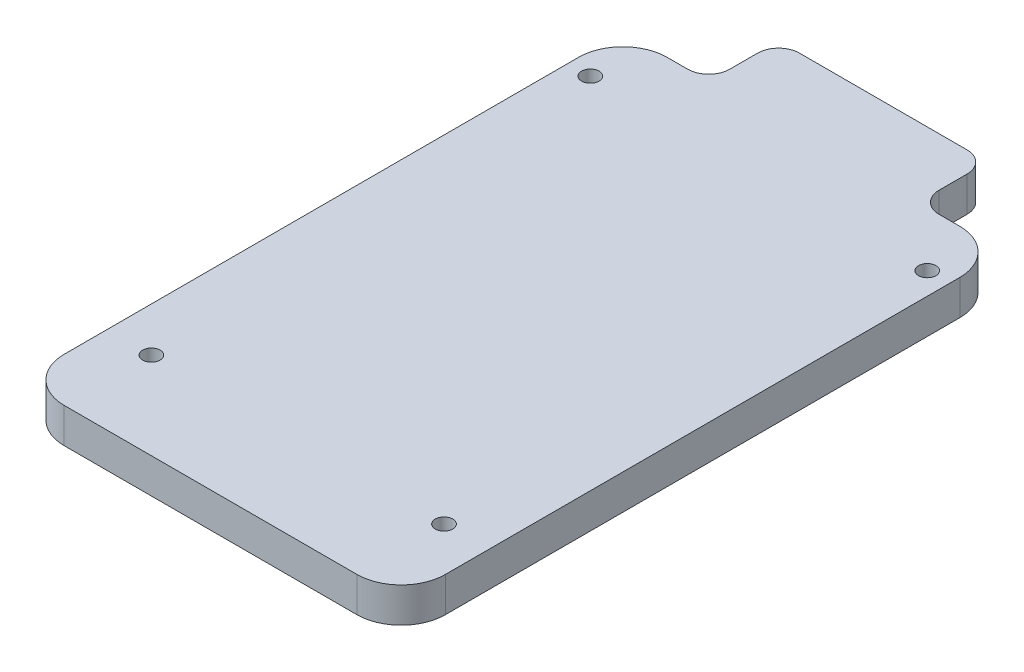
ISO-10303-21;
HEADER;
FILE_DESCRIPTION(('STEP AP214'),'2;1');
FILE_NAME('part.step','',(''),(''),'','','');
FILE_SCHEMA(('AUTOMOTIVE_DESIGN { 1 0 10303 214 1 1 1 1 }'));
ENDSEC;
DATA;
#1=APPLICATION_CONTEXT('core data for automotive mechanical design processes');
#2=APPLICATION_PROTOCOL_DEFINITION('international standard','automotive_design',2000,#1);
#3=PRODUCT_CONTEXT('',#1,'mechanical');
#4=PRODUCT('Part','Part','',(#3));
#5=PRODUCT_RELATED_PRODUCT_CATEGORY('part','',(#4));
#6=PRODUCT_DEFINITION_FORMATION('','',#4);
#7=PRODUCT_DEFINITION_CONTEXT('part definition',#1,'design');
#8=PRODUCT_DEFINITION('design','',#6,#7);
#9=PRODUCT_DEFINITION_SHAPE('','',#8);
#10=(LENGTH_UNIT() NAMED_UNIT(*) SI_UNIT(.MILLI.,.METRE.));
#11=(NAMED_UNIT(*) PLANE_ANGLE_UNIT() SI_UNIT($,.RADIAN.));
#12=(NAMED_UNIT(*) SI_UNIT($,.STERADIAN.) SOLID_ANGLE_UNIT());
#13=UNCERTAINTY_MEASURE_WITH_UNIT(LENGTH_MEASURE(1.E-05),#10,'distance_accuracy_value','');
#14=(GEOMETRIC_REPRESENTATION_CONTEXT(3) GLOBAL_UNCERTAINTY_ASSIGNED_CONTEXT((#13)) GLOBAL_UNIT_ASSIGNED_CONTEXT((#10,
#11,#12)) REPRESENTATION_CONTEXT('',''));
#15=CARTESIAN_POINT('',(0.,0.,0.));
#16=DIRECTION('',(0.,0.,1.));
#17=DIRECTION('',(1.,0.,0.));
#18=AXIS2_PLACEMENT_3D('',#15,#16,#17);
#19=CARTESIAN_POINT('',(20.955,5.,-43.18));
#20=DIRECTION('',(0.,0.,1.));
#21=DIRECTION('',(1.,0.,0.));
#22=AXIS2_PLACEMENT_3D('',#19,#20,#21);
#23=PLANE('',#22);
#24=DIRECTION('',(-1.,0.,0.));
#25=VECTOR('',#24,1.);
#26=CARTESIAN_POINT('',(20.955,5.,-43.18));
#27=LINE('',#26,#25);
#28=CARTESIAN_POINT('',(-18.,5.,-43.18));
#29=VERTEX_POINT('',#28);
#30=CARTESIAN_POINT('',(-20.955,5.,-43.18));
#31=VERTEX_POINT('',#30);
#32=EDGE_CURVE('E225',#29,#31,#27,.T.);
#33=ORIENTED_EDGE('',*,*,#32,.F.);
#34=DIRECTION('',(0.,1.,0.));
#35=VECTOR('',#34,1.);
#36=CARTESIAN_POINT('',(-18.,5.,-43.18));
#37=LINE('',#36,#35);
#38=CARTESIAN_POINT('',(-18.,0.,-43.18));
#39=VERTEX_POINT('',#38);
#40=EDGE_CURVE('E299',#29,#39,#37,.F.);
#41=ORIENTED_EDGE('',*,*,#40,.T.);
#42=DIRECTION('',(-1.,0.,0.));
#43=VECTOR('',#42,1.);
#44=CARTESIAN_POINT('',(20.955,0.,-43.18));
#45=LINE('',#44,#43);
#46=CARTESIAN_POINT('',(-20.955,0.,-43.18));
#47=VERTEX_POINT('',#46);
#48=EDGE_CURVE('E244',#39,#47,#45,.T.);
#49=ORIENTED_EDGE('',*,*,#48,.T.);
#50=DIRECTION('',(0.,-1.,0.));
#51=VECTOR('',#50,1.);
#52=CARTESIAN_POINT('',(-20.955,5.,-43.18));
#53=LINE('',#52,#51);
#54=EDGE_CURVE('E256',#31,#47,#53,.T.);
#55=ORIENTED_EDGE('',*,*,#54,.F.);
#56=EDGE_LOOP('',(#33,#41,#49,#55));
#57=FACE_BOUND('',#56,.T.);
#58=ADVANCED_FACE('F33',(#57),#23,.F.);
#59=CARTESIAN_POINT('',(-20.955,5.,36.83));
#60=DIRECTION('',(0.,-1.,0.));
#61=DIRECTION('',(0.,0.,-1.));
#62=AXIS2_PLACEMENT_3D('',#59,#60,#61);
#63=CYLINDRICAL_SURFACE('',#62,6.35);
#64=CARTESIAN_POINT('',(-20.955,0.,36.83));
#65=DIRECTION('',(0.,1.,0.));
#66=DIRECTION('',(0.,0.,-1.));
#67=AXIS2_PLACEMENT_3D('',#64,#65,#66);
#68=CIRCLE('',#67,6.35);
#69=CARTESIAN_POINT('',(-27.305,0.,36.83));
#70=VERTEX_POINT('',#69);
#71=CARTESIAN_POINT('',(-20.955,0.,43.18));
#72=VERTEX_POINT('',#71);
#73=EDGE_CURVE('E212',#70,#72,#68,.T.);
#74=ORIENTED_EDGE('',*,*,#73,.T.);
#75=DIRECTION('',(0.,-1.,0.));
#76=VECTOR('',#75,1.);
#77=CARTESIAN_POINT('',(-20.955,5.,43.18));
#78=LINE('',#77,#76);
#79=CARTESIAN_POINT('',(-20.955,5.,43.18));
#80=VERTEX_POINT('',#79);
#81=EDGE_CURVE('E271',#80,#72,#78,.T.);
#82=ORIENTED_EDGE('',*,*,#81,.F.);
#83=CARTESIAN_POINT('',(-20.955,5.,36.83));
#84=DIRECTION('',(0.,1.,0.));
#85=DIRECTION('',(0.,0.,-1.));
#86=AXIS2_PLACEMENT_3D('',#83,#84,#85);
#87=CIRCLE('',#86,6.35);
#88=CARTESIAN_POINT('',(-27.305,5.,36.83));
#89=VERTEX_POINT('',#88);
#90=EDGE_CURVE('E213',#89,#80,#87,.T.);
#91=ORIENTED_EDGE('',*,*,#90,.F.);
#92=DIRECTION('',(0.,-1.,0.));
#93=VECTOR('',#92,1.);
#94=CARTESIAN_POINT('',(-27.305,5.,36.83));
#95=LINE('',#94,#93);
#96=EDGE_CURVE('E233',#89,#70,#95,.T.);
#97=ORIENTED_EDGE('',*,*,#96,.T.);
#98=EDGE_LOOP('',(#74,#82,#91,#97));
#99=FACE_BOUND('',#98,.T.);
#100=ADVANCED_FACE('F364',(#99),#63,.T.);
#101=CARTESIAN_POINT('',(20.955,5.,43.18));
#102=DIRECTION('',(0.,0.,-1.));
#103=DIRECTION('',(-1.,0.,0.));
#104=AXIS2_PLACEMENT_3D('',#101,#102,#103);
#105=PLANE('',#104);
#106=DIRECTION('',(1.,0.,0.));
#107=VECTOR('',#106,1.);
#108=CARTESIAN_POINT('',(20.955,0.,43.18));
#109=LINE('',#108,#107);
#110=CARTESIAN_POINT('',(20.955,0.,43.18));
#111=VERTEX_POINT('',#110);
#112=EDGE_CURVE('E236',#72,#111,#109,.T.);
#113=ORIENTED_EDGE('',*,*,#112,.T.);
#114=DIRECTION('',(0.,-1.,0.));
#115=VECTOR('',#114,1.);
#116=CARTESIAN_POINT('',(20.955,5.,43.18));
#117=LINE('',#116,#115);
#118=CARTESIAN_POINT('',(20.955,5.,43.18));
#119=VERTEX_POINT('',#118);
#120=EDGE_CURVE('E268',#119,#111,#117,.T.);
#121=ORIENTED_EDGE('',*,*,#120,.F.);
#122=DIRECTION('',(1.,0.,0.));
#123=VECTOR('',#122,1.);
#124=CARTESIAN_POINT('',(20.955,5.,43.18));
#125=LINE('',#124,#123);
#126=EDGE_CURVE('E216',#80,#119,#125,.T.);
#127=ORIENTED_EDGE('',*,*,#126,.F.);
#128=ORIENTED_EDGE('',*,*,#81,.T.);
#129=EDGE_LOOP('',(#113,#121,#127,#128));
#130=FACE_BOUND('',#129,.T.);
#131=ADVANCED_FACE('F358',(#130),#105,.F.);
#132=CARTESIAN_POINT('',(20.955,5.,36.83));
#133=DIRECTION('',(0.,-1.,0.));
#134=DIRECTION('',(0.,0.,-1.));
#135=AXIS2_PLACEMENT_3D('',#132,#133,#134);
#136=CYLINDRICAL_SURFACE('',#135,6.35);
#137=CARTESIAN_POINT('',(20.955,0.,36.83));
#138=DIRECTION('',(0.,1.,0.));
#139=DIRECTION('',(0.,0.,1.));
#140=AXIS2_PLACEMENT_3D('',#137,#138,#139);
#141=CIRCLE('',#140,6.35);
#142=CARTESIAN_POINT('',(27.305,0.,36.83));
#143=VERTEX_POINT('',#142);
#144=EDGE_CURVE('E238',#111,#143,#141,.T.);
#145=ORIENTED_EDGE('',*,*,#144,.T.);
#146=DIRECTION('',(0.,-1.,0.));
#147=VECTOR('',#146,1.);
#148=CARTESIAN_POINT('',(27.305,5.,36.83));
#149=LINE('',#148,#147);
#150=CARTESIAN_POINT('',(27.305,5.,36.83));
#151=VERTEX_POINT('',#150);
#152=EDGE_CURVE('E265',#151,#143,#149,.T.);
#153=ORIENTED_EDGE('',*,*,#152,.F.);
#154=CARTESIAN_POINT('',(20.955,5.,36.83));
#155=DIRECTION('',(0.,1.,0.));
#156=DIRECTION('',(0.,0.,1.));
#157=AXIS2_PLACEMENT_3D('',#154,#155,#156);
#158=CIRCLE('',#157,6.35);
#159=EDGE_CURVE('E219',#119,#151,#158,.T.);
#160=ORIENTED_EDGE('',*,*,#159,.F.);
#161=ORIENTED_EDGE('',*,*,#120,.T.);
#162=EDGE_LOOP('',(#145,#153,#160,#161));
#163=FACE_BOUND('',#162,.T.);
#164=ADVANCED_FACE('F355',(#163),#136,.T.);
#165=CARTESIAN_POINT('',(27.305,5.,36.83));
#166=DIRECTION('',(-1.,0.,0.));
#167=DIRECTION('',(0.,0.,1.));
#168=AXIS2_PLACEMENT_3D('',#165,#166,#167);
#169=PLANE('',#168);
#170=DIRECTION('',(0.,0.,-1.));
#171=VECTOR('',#170,1.);
#172=CARTESIAN_POINT('',(27.305,0.,36.83));
#173=LINE('',#172,#171);
#174=CARTESIAN_POINT('',(27.305,0.,-36.83));
#175=VERTEX_POINT('',#174);
#176=EDGE_CURVE('E240',#143,#175,#173,.T.);
#177=ORIENTED_EDGE('',*,*,#176,.T.);
#178=DIRECTION('',(0.,-1.,0.));
#179=VECTOR('',#178,1.);
#180=CARTESIAN_POINT('',(27.305,5.,-36.83));
#181=LINE('',#180,#179);
#182=CARTESIAN_POINT('',(27.305,5.,-36.83));
#183=VERTEX_POINT('',#182);
#184=EDGE_CURVE('E262',#183,#175,#181,.T.);
#185=ORIENTED_EDGE('',*,*,#184,.F.);
#186=DIRECTION('',(0.,0.,-1.));
#187=VECTOR('',#186,1.);
#188=CARTESIAN_POINT('',(27.305,5.,36.83));
#189=LINE('',#188,#187);
#190=EDGE_CURVE('E221',#151,#183,#189,.T.);
#191=ORIENTED_EDGE('',*,*,#190,.F.);
#192=ORIENTED_EDGE('',*,*,#152,.T.);
#193=EDGE_LOOP('',(#177,#185,#191,#192));
#194=FACE_BOUND('',#193,.T.);
#195=ADVANCED_FACE('F351',(#194),#169,.F.);
#196=CARTESIAN_POINT('',(20.955,5.,-36.83));
#197=DIRECTION('',(0.,-1.,0.));
#198=DIRECTION('',(0.,0.,-1.));
#199=AXIS2_PLACEMENT_3D('',#196,#197,#198);
#200=CYLINDRICAL_SURFACE('',#199,6.35);
#201=CARTESIAN_POINT('',(20.955,0.,-36.83));
#202=DIRECTION('',(0.,1.,0.));
#203=DIRECTION('',(0.,0.,1.));
#204=AXIS2_PLACEMENT_3D('',#201,#202,#203);
#205=CIRCLE('',#204,6.35);
#206=CARTESIAN_POINT('',(20.955,0.,-43.18));
#207=VERTEX_POINT('',#206);
#208=EDGE_CURVE('E242',#175,#207,#205,.T.);
#209=ORIENTED_EDGE('',*,*,#208,.T.);
#210=DIRECTION('',(0.,-1.,0.));
#211=VECTOR('',#210,1.);
#212=CARTESIAN_POINT('',(20.955,5.,-43.18));
#213=LINE('',#212,#211);
#214=CARTESIAN_POINT('',(20.955,5.,-43.18));
#215=VERTEX_POINT('',#214);
#216=EDGE_CURVE('E259',#215,#207,#213,.T.);
#217=ORIENTED_EDGE('',*,*,#216,.F.);
#218=CARTESIAN_POINT('',(20.955,5.,-36.83));
#219=DIRECTION('',(0.,1.,0.));
#220=DIRECTION('',(0.,0.,1.));
#221=AXIS2_PLACEMENT_3D('',#218,#219,#220);
#222=CIRCLE('',#221,6.35);
#223=EDGE_CURVE('E223',#183,#215,#222,.T.);
#224=ORIENTED_EDGE('',*,*,#223,.F.);
#225=ORIENTED_EDGE('',*,*,#184,.T.);
#226=EDGE_LOOP('',(#209,#217,#224,#225));
#227=FACE_BOUND('',#226,.T.);
#228=ADVANCED_FACE('F346',(#227),#200,.T.);
#229=CARTESIAN_POINT('',(18.,0.,-43.18));
#230=VERTEX_POINT('',#229);
#231=EDGE_CURVE('E245',#207,#230,#45,.T.);
#232=ORIENTED_EDGE('',*,*,#231,.T.);
#233=DIRECTION('',(0.,1.,0.));
#234=VECTOR('',#233,1.);
#235=CARTESIAN_POINT('',(18.,5.,-43.18));
#236=LINE('',#235,#234);
#237=CARTESIAN_POINT('',(18.,5.,-43.18));
#238=VERTEX_POINT('',#237);
#239=EDGE_CURVE('E274',#230,#238,#236,.T.);
#240=ORIENTED_EDGE('',*,*,#239,.T.);
#241=EDGE_CURVE('E226',#215,#238,#27,.T.);
#242=ORIENTED_EDGE('',*,*,#241,.F.);
#243=ORIENTED_EDGE('',*,*,#216,.T.);
#244=EDGE_LOOP('',(#232,#240,#242,#243));
#245=FACE_BOUND('',#244,.T.);
#246=ADVANCED_FACE('F340',(#245),#23,.F.);
#247=CARTESIAN_POINT('',(-20.955,5.,-36.83));
#248=DIRECTION('',(0.,-1.,0.));
#249=DIRECTION('',(0.,0.,-1.));
#250=AXIS2_PLACEMENT_3D('',#247,#248,#249);
#251=CYLINDRICAL_SURFACE('',#250,6.35);
#252=CARTESIAN_POINT('',(-20.955,0.,-36.83));
#253=DIRECTION('',(0.,1.,0.));
#254=DIRECTION('',(0.,0.,1.));
#255=AXIS2_PLACEMENT_3D('',#252,#253,#254);
#256=CIRCLE('',#255,6.35);
#257=CARTESIAN_POINT('',(-27.305,0.,-36.83));
#258=VERTEX_POINT('',#257);
#259=EDGE_CURVE('E248',#47,#258,#256,.T.);
#260=ORIENTED_EDGE('',*,*,#259,.T.);
#261=DIRECTION('',(0.,-1.,0.));
#262=VECTOR('',#261,1.);
#263=CARTESIAN_POINT('',(-27.305,5.,-36.83));
#264=LINE('',#263,#262);
#265=CARTESIAN_POINT('',(-27.305,5.,-36.83));
#266=VERTEX_POINT('',#265);
#267=EDGE_CURVE('E253',#266,#258,#264,.T.);
#268=ORIENTED_EDGE('',*,*,#267,.F.);
#269=CARTESIAN_POINT('',(-20.955,5.,-36.83));
#270=DIRECTION('',(0.,1.,0.));
#271=DIRECTION('',(0.,0.,1.));
#272=AXIS2_PLACEMENT_3D('',#269,#270,#271);
#273=CIRCLE('',#272,6.35);
#274=EDGE_CURVE('E229',#31,#266,#273,.T.);
#275=ORIENTED_EDGE('',*,*,#274,.F.);
#276=ORIENTED_EDGE('',*,*,#54,.T.);
#277=EDGE_LOOP('',(#260,#268,#275,#276));
#278=FACE_BOUND('',#277,.T.);
#279=ADVANCED_FACE('F372',(#278),#251,.T.);
#280=CARTESIAN_POINT('',(-27.305,5.,36.83));
#281=DIRECTION('',(1.,0.,0.));
#282=DIRECTION('',(0.,0.,-1.));
#283=AXIS2_PLACEMENT_3D('',#280,#281,#282);
#284=PLANE('',#283);
#285=DIRECTION('',(0.,0.,1.));
#286=VECTOR('',#285,1.);
#287=CARTESIAN_POINT('',(-27.305,0.,36.83));
#288=LINE('',#287,#286);
#289=EDGE_CURVE('E217',#258,#70,#288,.T.);
#290=ORIENTED_EDGE('',*,*,#289,.T.);
#291=ORIENTED_EDGE('',*,*,#96,.F.);
#292=DIRECTION('',(0.,0.,1.));
#293=VECTOR('',#292,1.);
#294=CARTESIAN_POINT('',(-27.305,5.,36.83));
#295=LINE('',#294,#293);
#296=EDGE_CURVE('E231',#266,#89,#295,.T.);
#297=ORIENTED_EDGE('',*,*,#296,.F.);
#298=ORIENTED_EDGE('',*,*,#267,.T.);
#299=EDGE_LOOP('',(#290,#291,#297,#298));
#300=FACE_BOUND('',#299,.T.);
#301=ADVANCED_FACE('F369',(#300),#284,.F.);
#302=CARTESIAN_POINT('',(-20.955,5.,36.83));
#303=DIRECTION('',(0.,-1.,0.));
#304=DIRECTION('',(0.,0.,-1.));
#305=AXIS2_PLACEMENT_3D('',#302,#303,#304);
#306=PLANE('',#305);
#307=CARTESIAN_POINT('',(-24.13,5.,-35.3453521126761));
#308=DIRECTION('',(0.,1.,0.));
#309=DIRECTION('',(0.,0.,1.));
#310=AXIS2_PLACEMENT_3D('',#307,#308,#309);
#311=CIRCLE('',#310,1.25);
#312=CARTESIAN_POINT('',(-24.13,5.,-34.0953521126761));
#313=VERTEX_POINT('',#312);
#314=EDGE_CURVE('E181',#313,#313,#311,.T.);
#315=ORIENTED_EDGE('',*,*,#314,.F.);
#316=EDGE_LOOP('',(#315));
#317=FACE_BOUND('',#316,.T.);
#318=CARTESIAN_POINT('',(24.13,5.,-35.3453521126761));
#319=DIRECTION('',(0.,1.,0.));
#320=DIRECTION('',(0.,0.,1.));
#321=AXIS2_PLACEMENT_3D('',#318,#319,#320);
#322=CIRCLE('',#321,1.25);
#323=CARTESIAN_POINT('',(24.13,5.,-34.0953521126761));
#324=VERTEX_POINT('',#323);
#325=EDGE_CURVE('E194',#324,#324,#322,.T.);
#326=ORIENTED_EDGE('',*,*,#325,.F.);
#327=EDGE_LOOP('',(#326));
#328=FACE_BOUND('',#327,.T.);
#329=CARTESIAN_POINT('',(-20.955,5.,30.6946478873239));
#330=DIRECTION('',(0.,1.,0.));
#331=DIRECTION('',(0.,0.,1.));
#332=AXIS2_PLACEMENT_3D('',#329,#330,#331);
#333=CIRCLE('',#332,1.25);
#334=CARTESIAN_POINT('',(-20.955,5.,31.9446478873239));
#335=VERTEX_POINT('',#334);
#336=EDGE_CURVE('E200',#335,#335,#333,.T.);
#337=ORIENTED_EDGE('',*,*,#336,.F.);
#338=EDGE_LOOP('',(#337));
#339=FACE_BOUND('',#338,.T.);
#340=CARTESIAN_POINT('',(20.955,5.,30.6946478873239));
#341=DIRECTION('',(0.,1.,0.));
#342=DIRECTION('',(0.,0.,1.));
#343=AXIS2_PLACEMENT_3D('',#340,#341,#342);
#344=CIRCLE('',#343,1.25);
#345=CARTESIAN_POINT('',(20.955,5.,31.9446478873239));
#346=VERTEX_POINT('',#345);
#347=EDGE_CURVE('E206',#346,#346,#344,.T.);
#348=ORIENTED_EDGE('',*,*,#347,.F.);
#349=EDGE_LOOP('',(#348));
#350=FACE_BOUND('',#349,.T.);
#351=DIRECTION('',(0.,0.,-1.));
#352=VECTOR('',#351,1.);
#353=CARTESIAN_POINT('',(15.,5.,-43.18));
#354=LINE('',#353,#352);
#355=CARTESIAN_POINT('',(15.,5.,-46.18));
#356=VERTEX_POINT('',#355);
#357=CARTESIAN_POINT('',(15.,5.,-50.18));
#358=VERTEX_POINT('',#357);
#359=EDGE_CURVE('E184',#356,#358,#354,.T.);
#360=ORIENTED_EDGE('',*,*,#359,.T.);
#361=CARTESIAN_POINT('',(12.,5.,-50.18));
#362=DIRECTION('',(0.,-1.,0.));
#363=DIRECTION('',(0.,0.,-1.));
#364=AXIS2_PLACEMENT_3D('',#361,#362,#363);
#365=CIRCLE('',#364,3.);
#366=CARTESIAN_POINT('',(12.,5.,-53.18));
#367=VERTEX_POINT('',#366);
#368=EDGE_CURVE('E284',#358,#367,#365,.F.);
#369=ORIENTED_EDGE('',*,*,#368,.T.);
#370=DIRECTION('',(-1.,0.,0.));
#371=VECTOR('',#370,1.);
#372=CARTESIAN_POINT('',(-15.,5.,-53.18));
#373=LINE('',#372,#371);
#374=CARTESIAN_POINT('',(-12.,5.,-53.18));
#375=VERTEX_POINT('',#374);
#376=EDGE_CURVE('E175',#367,#375,#373,.T.);
#377=ORIENTED_EDGE('',*,*,#376,.T.);
#378=CARTESIAN_POINT('',(-12.,5.,-50.18));
#379=DIRECTION('',(0.,-1.,0.));
#380=DIRECTION('',(0.,0.,-1.));
#381=AXIS2_PLACEMENT_3D('',#378,#379,#380);
#382=CIRCLE('',#381,3.);
#383=CARTESIAN_POINT('',(-15.,5.,-50.18));
#384=VERTEX_POINT('',#383);
#385=EDGE_CURVE('E282',#375,#384,#382,.F.);
#386=ORIENTED_EDGE('',*,*,#385,.T.);
#387=DIRECTION('',(0.,0.,1.));
#388=VECTOR('',#387,1.);
#389=CARTESIAN_POINT('',(-15.,5.,-43.18));
#390=LINE('',#389,#388);
#391=CARTESIAN_POINT('',(-15.,5.,-46.18));
#392=VERTEX_POINT('',#391);
#393=EDGE_CURVE('E171',#384,#392,#390,.T.);
#394=ORIENTED_EDGE('',*,*,#393,.T.);
#395=CARTESIAN_POINT('',(-18.,5.,-46.18));
#396=DIRECTION('',(0.,-1.,0.));
#397=DIRECTION('',(0.,0.,-1.));
#398=AXIS2_PLACEMENT_3D('',#395,#396,#397);
#399=CIRCLE('',#398,3.);
#400=EDGE_CURVE('E41',#392,#29,#399,.T.);
#401=ORIENTED_EDGE('',*,*,#400,.T.);
#402=ORIENTED_EDGE('',*,*,#32,.T.);
#403=ORIENTED_EDGE('',*,*,#274,.T.);
#404=ORIENTED_EDGE('',*,*,#296,.T.);
#405=ORIENTED_EDGE('',*,*,#90,.T.);
#406=ORIENTED_EDGE('',*,*,#126,.T.);
#407=ORIENTED_EDGE('',*,*,#159,.T.);
#408=ORIENTED_EDGE('',*,*,#190,.T.);
#409=ORIENTED_EDGE('',*,*,#223,.T.);
#410=ORIENTED_EDGE('',*,*,#241,.T.);
#411=CARTESIAN_POINT('',(18.,5.,-46.18));
#412=DIRECTION('',(0.,-1.,0.));
#413=DIRECTION('',(0.,0.,-1.));
#414=AXIS2_PLACEMENT_3D('',#411,#412,#413);
#415=CIRCLE('',#414,3.);
#416=EDGE_CURVE('E301',#238,#356,#415,.T.);
#417=ORIENTED_EDGE('',*,*,#416,.T.);
#418=EDGE_LOOP('',(#360,#369,#377,#386,#394,#401,#402,#403,#404,#405,#406,#407,#408,#409,#410,#417));
#419=FACE_BOUND('',#418,.T.);
#420=ADVANCED_FACE('F306',(#317,#328,#339,#350,#419),#306,.F.);
#421=CARTESIAN_POINT('',(-20.955,0.,36.83));
#422=DIRECTION('',(0.,-1.,0.));
#423=DIRECTION('',(0.,0.,-1.));
#424=AXIS2_PLACEMENT_3D('',#421,#422,#423);
#425=PLANE('',#424);
#426=CARTESIAN_POINT('',(-24.13,0.,-35.3453521126761));
#427=DIRECTION('',(0.,-1.,0.));
#428=DIRECTION('',(0.,0.,-1.));
#429=AXIS2_PLACEMENT_3D('',#426,#427,#428);
#430=CIRCLE('',#429,1.25);
#431=CARTESIAN_POINT('',(-24.13,0.,-36.5953521126761));
#432=VERTEX_POINT('',#431);
#433=EDGE_CURVE('E191',#432,#432,#430,.T.);
#434=ORIENTED_EDGE('',*,*,#433,.F.);
#435=EDGE_LOOP('',(#434));
#436=FACE_BOUND('',#435,.T.);
#437=CARTESIAN_POINT('',(24.13,0.,-35.3453521126761));
#438=DIRECTION('',(0.,-1.,0.));
#439=DIRECTION('',(0.,0.,-1.));
#440=AXIS2_PLACEMENT_3D('',#437,#438,#439);
#441=CIRCLE('',#440,1.25);
#442=CARTESIAN_POINT('',(24.13,0.,-36.5953521126761));
#443=VERTEX_POINT('',#442);
#444=EDGE_CURVE('E197',#443,#443,#441,.T.);
#445=ORIENTED_EDGE('',*,*,#444,.F.);
#446=EDGE_LOOP('',(#445));
#447=FACE_BOUND('',#446,.T.);
#448=CARTESIAN_POINT('',(-20.955,0.,30.6946478873239));
#449=DIRECTION('',(0.,-1.,0.));
#450=DIRECTION('',(0.,0.,-1.));
#451=AXIS2_PLACEMENT_3D('',#448,#449,#450);
#452=CIRCLE('',#451,1.25);
#453=CARTESIAN_POINT('',(-20.955,0.,29.4446478873239));
#454=VERTEX_POINT('',#453);
#455=EDGE_CURVE('E203',#454,#454,#452,.T.);
#456=ORIENTED_EDGE('',*,*,#455,.F.);
#457=EDGE_LOOP('',(#456));
#458=FACE_BOUND('',#457,.T.);
#459=CARTESIAN_POINT('',(20.955,0.,30.6946478873239));
#460=DIRECTION('',(0.,-1.,0.));
#461=DIRECTION('',(0.,0.,-1.));
#462=AXIS2_PLACEMENT_3D('',#459,#460,#461);
#463=CIRCLE('',#462,1.25);
#464=CARTESIAN_POINT('',(20.955,0.,29.4446478873239));
#465=VERTEX_POINT('',#464);
#466=EDGE_CURVE('E209',#465,#465,#463,.T.);
#467=ORIENTED_EDGE('',*,*,#466,.F.);
#468=EDGE_LOOP('',(#467));
#469=FACE_BOUND('',#468,.T.);
#470=DIRECTION('',(-1.,0.,0.));
#471=VECTOR('',#470,1.);
#472=CARTESIAN_POINT('',(-15.,0.,-53.18));
#473=LINE('',#472,#471);
#474=CARTESIAN_POINT('',(12.,0.,-53.18));
#475=VERTEX_POINT('',#474);
#476=CARTESIAN_POINT('',(-12.,0.,-53.18));
#477=VERTEX_POINT('',#476);
#478=EDGE_CURVE('E178',#475,#477,#473,.T.);
#479=ORIENTED_EDGE('',*,*,#478,.F.);
#480=CARTESIAN_POINT('',(12.,0.,-50.18));
#481=DIRECTION('',(0.,-1.,0.));
#482=DIRECTION('',(0.,0.,-1.));
#483=AXIS2_PLACEMENT_3D('',#480,#481,#482);
#484=CIRCLE('',#483,3.);
#485=CARTESIAN_POINT('',(15.,0.,-50.18));
#486=VERTEX_POINT('',#485);
#487=EDGE_CURVE('E293',#475,#486,#484,.T.);
#488=ORIENTED_EDGE('',*,*,#487,.T.);
#489=DIRECTION('',(0.,0.,-1.));
#490=VECTOR('',#489,1.);
#491=CARTESIAN_POINT('',(15.,0.,-43.18));
#492=LINE('',#491,#490);
#493=CARTESIAN_POINT('',(15.,0.,-46.18));
#494=VERTEX_POINT('',#493);
#495=EDGE_CURVE('E174',#494,#486,#492,.T.);
#496=ORIENTED_EDGE('',*,*,#495,.F.);
#497=CARTESIAN_POINT('',(18.,0.,-46.18));
#498=DIRECTION('',(0.,-1.,0.));
#499=DIRECTION('',(0.,0.,-1.));
#500=AXIS2_PLACEMENT_3D('',#497,#498,#499);
#501=CIRCLE('',#500,3.);
#502=EDGE_CURVE('E303',#494,#230,#501,.F.);
#503=ORIENTED_EDGE('',*,*,#502,.T.);
#504=ORIENTED_EDGE('',*,*,#231,.F.);
#505=ORIENTED_EDGE('',*,*,#208,.F.);
#506=ORIENTED_EDGE('',*,*,#176,.F.);
#507=ORIENTED_EDGE('',*,*,#144,.F.);
#508=ORIENTED_EDGE('',*,*,#112,.F.);
#509=ORIENTED_EDGE('',*,*,#73,.F.);
#510=ORIENTED_EDGE('',*,*,#289,.F.);
#511=ORIENTED_EDGE('',*,*,#259,.F.);
#512=ORIENTED_EDGE('',*,*,#48,.F.);
#513=CARTESIAN_POINT('',(-18.,0.,-46.18));
#514=DIRECTION('',(0.,-1.,0.));
#515=DIRECTION('',(0.,0.,-1.));
#516=AXIS2_PLACEMENT_3D('',#513,#514,#515);
#517=CIRCLE('',#516,3.);
#518=CARTESIAN_POINT('',(-15.,0.,-46.18));
#519=VERTEX_POINT('',#518);
#520=EDGE_CURVE('E11',#39,#519,#517,.F.);
#521=ORIENTED_EDGE('',*,*,#520,.T.);
#522=DIRECTION('',(0.,0.,1.));
#523=VECTOR('',#522,1.);
#524=CARTESIAN_POINT('',(-15.,0.,-43.18));
#525=LINE('',#524,#523);
#526=CARTESIAN_POINT('',(-15.,0.,-50.18));
#527=VERTEX_POINT('',#526);
#528=EDGE_CURVE('E172',#527,#519,#525,.T.);
#529=ORIENTED_EDGE('',*,*,#528,.F.);
#530=CARTESIAN_POINT('',(-12.,0.,-50.18));
#531=DIRECTION('',(0.,-1.,0.));
#532=DIRECTION('',(0.,0.,-1.));
#533=AXIS2_PLACEMENT_3D('',#530,#531,#532);
#534=CIRCLE('',#533,3.);
#535=EDGE_CURVE('E291',#527,#477,#534,.T.);
#536=ORIENTED_EDGE('',*,*,#535,.T.);
#537=EDGE_LOOP('',(#479,#488,#496,#503,#504,#505,#506,#507,#508,#509,#510,#511,#512,#521,#529,#536));
#538=FACE_BOUND('',#537,.T.);
#539=ADVANCED_FACE('F316',(#436,#447,#458,#469,#538),#425,.T.);
#540=CARTESIAN_POINT('',(20.955,5.,30.6946478873239));
#541=DIRECTION('',(0.,1.,0.));
#542=DIRECTION('',(0.,0.,1.));
#543=AXIS2_PLACEMENT_3D('',#540,#541,#542);
#544=CYLINDRICAL_SURFACE('',#543,1.25);
#545=ORIENTED_EDGE('',*,*,#347,.T.);
#546=EDGE_LOOP('',(#545));
#547=FACE_BOUND('',#546,.T.);
#548=ORIENTED_EDGE('',*,*,#466,.T.);
#549=EDGE_LOOP('',(#548));
#550=FACE_BOUND('',#549,.T.);
#551=ADVANCED_FACE('F433',(#547,#550),#544,.F.);
#552=CARTESIAN_POINT('',(-20.955,5.,30.6946478873239));
#553=DIRECTION('',(0.,1.,0.));
#554=DIRECTION('',(0.,0.,1.));
#555=AXIS2_PLACEMENT_3D('',#552,#553,#554);
#556=CYLINDRICAL_SURFACE('',#555,1.25);
#557=ORIENTED_EDGE('',*,*,#336,.T.);
#558=EDGE_LOOP('',(#557));
#559=FACE_BOUND('',#558,.T.);
#560=ORIENTED_EDGE('',*,*,#455,.T.);
#561=EDGE_LOOP('',(#560));
#562=FACE_BOUND('',#561,.T.);
#563=ADVANCED_FACE('F429',(#559,#562),#556,.F.);
#564=CARTESIAN_POINT('',(24.13,5.,-35.3453521126761));
#565=DIRECTION('',(0.,1.,0.));
#566=DIRECTION('',(0.,0.,1.));
#567=AXIS2_PLACEMENT_3D('',#564,#565,#566);
#568=CYLINDRICAL_SURFACE('',#567,1.25);
#569=ORIENTED_EDGE('',*,*,#325,.T.);
#570=EDGE_LOOP('',(#569));
#571=FACE_BOUND('',#570,.T.);
#572=ORIENTED_EDGE('',*,*,#444,.T.);
#573=EDGE_LOOP('',(#572));
#574=FACE_BOUND('',#573,.T.);
#575=ADVANCED_FACE('F425',(#571,#574),#568,.F.);
#576=CARTESIAN_POINT('',(-24.13,5.,-35.3453521126761));
#577=DIRECTION('',(0.,1.,0.));
#578=DIRECTION('',(0.,0.,1.));
#579=AXIS2_PLACEMENT_3D('',#576,#577,#578);
#580=CYLINDRICAL_SURFACE('',#579,1.25);
#581=ORIENTED_EDGE('',*,*,#314,.T.);
#582=EDGE_LOOP('',(#581));
#583=FACE_BOUND('',#582,.T.);
#584=ORIENTED_EDGE('',*,*,#433,.T.);
#585=EDGE_LOOP('',(#584));
#586=FACE_BOUND('',#585,.T.);
#587=ADVANCED_FACE('F422',(#583,#586),#580,.F.);
#588=CARTESIAN_POINT('',(-15.,0.,-43.18));
#589=DIRECTION('',(-1.,0.,0.));
#590=DIRECTION('',(0.,0.,1.));
#591=AXIS2_PLACEMENT_3D('',#588,#589,#590);
#592=PLANE('',#591);
#593=ORIENTED_EDGE('',*,*,#393,.F.);
#594=DIRECTION('',(0.,1.,0.));
#595=VECTOR('',#594,1.);
#596=CARTESIAN_POINT('',(-15.,0.,-50.18));
#597=LINE('',#596,#595);
#598=EDGE_CURVE('E53',#384,#527,#597,.F.);
#599=ORIENTED_EDGE('',*,*,#598,.T.);
#600=ORIENTED_EDGE('',*,*,#528,.T.);
#601=DIRECTION('',(0.,1.,0.));
#602=VECTOR('',#601,1.);
#603=CARTESIAN_POINT('',(-15.,0.,-46.18));
#604=LINE('',#603,#602);
#605=EDGE_CURVE('E295',#519,#392,#604,.T.);
#606=ORIENTED_EDGE('',*,*,#605,.T.);
#607=EDGE_LOOP('',(#593,#599,#600,#606));
#608=FACE_BOUND('',#607,.T.);
#609=ADVANCED_FACE('F313',(#608),#592,.T.);
#610=CARTESIAN_POINT('',(-15.,0.,-53.18));
#611=DIRECTION('',(0.,0.,-1.));
#612=DIRECTION('',(-1.,0.,0.));
#613=AXIS2_PLACEMENT_3D('',#610,#611,#612);
#614=PLANE('',#613);
#615=CARTESIAN_POINT('',(-8.,1.5,-53.18));
#616=DIRECTION('',(0.,0.,-1.));
#617=DIRECTION('',(-1.,0.,0.));
#618=AXIS2_PLACEMENT_3D('',#615,#616,#617);
#619=CIRCLE('',#618,1.24999999999999);
#620=CARTESIAN_POINT('',(-9.24999999999999,1.5,-53.18));
#621=VERTEX_POINT('',#620);
#622=EDGE_CURVE('E161',#621,#621,#619,.T.);
#623=ORIENTED_EDGE('',*,*,#622,.F.);
#624=EDGE_LOOP('',(#623));
#625=FACE_BOUND('',#624,.T.);
#626=CARTESIAN_POINT('',(8.,1.5,-53.18));
#627=DIRECTION('',(0.,0.,-1.));
#628=DIRECTION('',(-1.,0.,0.));
#629=AXIS2_PLACEMENT_3D('',#626,#627,#628);
#630=CIRCLE('',#629,1.24999999999999);
#631=CARTESIAN_POINT('',(6.75000000000001,1.5,-53.18));
#632=VERTEX_POINT('',#631);
#633=EDGE_CURVE('E160',#632,#632,#630,.T.);
#634=ORIENTED_EDGE('',*,*,#633,.F.);
#635=EDGE_LOOP('',(#634));
#636=FACE_BOUND('',#635,.T.);
#637=ORIENTED_EDGE('',*,*,#376,.F.);
#638=DIRECTION('',(0.,1.,0.));
#639=VECTOR('',#638,1.);
#640=CARTESIAN_POINT('',(12.,0.,-53.18));
#641=LINE('',#640,#639);
#642=EDGE_CURVE('E289',#367,#475,#641,.F.);
#643=ORIENTED_EDGE('',*,*,#642,.T.);
#644=ORIENTED_EDGE('',*,*,#478,.T.);
#645=DIRECTION('',(0.,1.,0.));
#646=VECTOR('',#645,1.);
#647=CARTESIAN_POINT('',(-12.,0.,-53.18));
#648=LINE('',#647,#646);
#649=EDGE_CURVE('E286',#477,#375,#648,.T.);
#650=ORIENTED_EDGE('',*,*,#649,.T.);
#651=EDGE_LOOP('',(#637,#643,#644,#650));
#652=FACE_BOUND('',#651,.T.);
#653=ADVANCED_FACE('F322',(#625,#636,#652),#614,.T.);
#654=CARTESIAN_POINT('',(15.,0.,-43.18));
#655=DIRECTION('',(1.,0.,0.));
#656=DIRECTION('',(0.,0.,-1.));
#657=AXIS2_PLACEMENT_3D('',#654,#655,#656);
#658=PLANE('',#657);
#659=ORIENTED_EDGE('',*,*,#359,.F.);
#660=DIRECTION('',(0.,1.,0.));
#661=VECTOR('',#660,1.);
#662=CARTESIAN_POINT('',(15.,0.,-46.18));
#663=LINE('',#662,#661);
#664=EDGE_CURVE('E280',#356,#494,#663,.F.);
#665=ORIENTED_EDGE('',*,*,#664,.T.);
#666=ORIENTED_EDGE('',*,*,#495,.T.);
#667=DIRECTION('',(0.,1.,0.));
#668=VECTOR('',#667,1.);
#669=CARTESIAN_POINT('',(15.,0.,-50.18));
#670=LINE('',#669,#668);
#671=EDGE_CURVE('E277',#486,#358,#670,.T.);
#672=ORIENTED_EDGE('',*,*,#671,.T.);
#673=EDGE_LOOP('',(#659,#665,#666,#672));
#674=FACE_BOUND('',#673,.T.);
#675=ADVANCED_FACE('F330',(#674),#658,.T.);
#676=CARTESIAN_POINT('',(18.,5.,-46.18));
#677=DIRECTION('',(0.,1.,0.));
#678=DIRECTION('',(0.,0.,1.));
#679=AXIS2_PLACEMENT_3D('',#676,#677,#678);
#680=CYLINDRICAL_SURFACE('',#679,3.);
#681=ORIENTED_EDGE('',*,*,#502,.F.);
#682=ORIENTED_EDGE('',*,*,#664,.F.);
#683=ORIENTED_EDGE('',*,*,#416,.F.);
#684=ORIENTED_EDGE('',*,*,#239,.F.);
#685=EDGE_LOOP('',(#681,#682,#683,#684));
#686=FACE_BOUND('',#685,.T.);
#687=ADVANCED_FACE('F337',(#686),#680,.F.);
#688=CARTESIAN_POINT('',(12.,0.,-50.18));
#689=DIRECTION('',(0.,1.,0.));
#690=DIRECTION('',(0.,0.,1.));
#691=AXIS2_PLACEMENT_3D('',#688,#689,#690);
#692=CYLINDRICAL_SURFACE('',#691,3.);
#693=ORIENTED_EDGE('',*,*,#487,.F.);
#694=ORIENTED_EDGE('',*,*,#642,.F.);
#695=ORIENTED_EDGE('',*,*,#368,.F.);
#696=ORIENTED_EDGE('',*,*,#671,.F.);
#697=EDGE_LOOP('',(#693,#694,#695,#696));
#698=FACE_BOUND('',#697,.T.);
#699=ADVANCED_FACE('F328',(#698),#692,.T.);
#700=CARTESIAN_POINT('',(-12.,0.,-50.18));
#701=DIRECTION('',(0.,1.,0.));
#702=DIRECTION('',(0.,0.,1.));
#703=AXIS2_PLACEMENT_3D('',#700,#701,#702);
#704=CYLINDRICAL_SURFACE('',#703,3.);
#705=ORIENTED_EDGE('',*,*,#535,.F.);
#706=ORIENTED_EDGE('',*,*,#598,.F.);
#707=ORIENTED_EDGE('',*,*,#385,.F.);
#708=ORIENTED_EDGE('',*,*,#649,.F.);
#709=EDGE_LOOP('',(#705,#706,#707,#708));
#710=FACE_BOUND('',#709,.T.);
#711=ADVANCED_FACE('F319',(#710),#704,.T.);
#712=CARTESIAN_POINT('',(-18.,0.,-46.18));
#713=DIRECTION('',(0.,1.,0.));
#714=DIRECTION('',(0.,0.,1.));
#715=AXIS2_PLACEMENT_3D('',#712,#713,#714);
#716=CYLINDRICAL_SURFACE('',#715,3.);
#717=ORIENTED_EDGE('',*,*,#520,.F.);
#718=ORIENTED_EDGE('',*,*,#40,.F.);
#719=ORIENTED_EDGE('',*,*,#400,.F.);
#720=ORIENTED_EDGE('',*,*,#605,.F.);
#721=EDGE_LOOP('',(#717,#718,#719,#720));
#722=FACE_BOUND('',#721,.T.);
#723=ADVANCED_FACE('F35',(#722),#716,.F.);
#724=CARTESIAN_POINT('',(8.,1.5,-48.18));
#725=DIRECTION('',(0.,0.,-1.));
#726=DIRECTION('',(-1.,0.,0.));
#727=AXIS2_PLACEMENT_3D('',#724,#725,#726);
#728=CONICAL_SURFACE('',#727,1.25,1.02974425867665);
#729=CARTESIAN_POINT('',(8.,1.5,-47.4289242262156));
#730=VERTEX_POINT('',#729);
#731=VERTEX_LOOP('',#730);
#732=FACE_BOUND('',#731,.T.);
#733=CARTESIAN_POINT('',(8.,1.5,-48.18));
#734=DIRECTION('',(0.,0.,-1.));
#735=DIRECTION('',(-1.,0.,0.));
#736=AXIS2_PLACEMENT_3D('',#733,#734,#735);
#737=CIRCLE('',#736,1.25);
#738=CARTESIAN_POINT('',(6.75,1.5,-48.18));
#739=VERTEX_POINT('',#738);
#740=EDGE_CURVE('E164',#739,#739,#737,.T.);
#741=ORIENTED_EDGE('',*,*,#740,.T.);
#742=EDGE_LOOP('',(#741));
#743=FACE_BOUND('',#742,.T.);
#744=ADVANCED_FACE('F402',(#732,#743),#728,.F.);
#745=CARTESIAN_POINT('',(8.,1.5,-53.18));
#746=DIRECTION('',(0.,0.,-1.));
#747=DIRECTION('',(-1.,0.,0.));
#748=AXIS2_PLACEMENT_3D('',#745,#746,#747);
#749=CYLINDRICAL_SURFACE('',#748,1.24999999999999);
#750=ORIENTED_EDGE('',*,*,#740,.F.);
#751=EDGE_LOOP('',(#750));
#752=FACE_BOUND('',#751,.T.);
#753=ORIENTED_EDGE('',*,*,#633,.T.);
#754=EDGE_LOOP('',(#753));
#755=FACE_BOUND('',#754,.T.);
#756=ADVANCED_FACE('F154',(#752,#755),#749,.F.);
#757=CARTESIAN_POINT('',(-8.,1.5,-48.18));
#758=DIRECTION('',(0.,0.,-1.));
#759=DIRECTION('',(-1.,0.,0.));
#760=AXIS2_PLACEMENT_3D('',#757,#758,#759);
#761=CONICAL_SURFACE('',#760,1.25,1.02974425867665);
#762=CARTESIAN_POINT('',(-8.,1.5,-47.4289242262156));
#763=VERTEX_POINT('',#762);
#764=VERTEX_LOOP('',#763);
#765=FACE_BOUND('',#764,.T.);
#766=CARTESIAN_POINT('',(-8.,1.5,-48.18));
#767=DIRECTION('',(0.,0.,-1.));
#768=DIRECTION('',(-1.,0.,0.));
#769=AXIS2_PLACEMENT_3D('',#766,#767,#768);
#770=CIRCLE('',#769,1.25);
#771=CARTESIAN_POINT('',(-9.25,1.5,-48.18));
#772=VERTEX_POINT('',#771);
#773=EDGE_CURVE('E158',#772,#772,#770,.T.);
#774=ORIENTED_EDGE('',*,*,#773,.T.);
#775=EDGE_LOOP('',(#774));
#776=FACE_BOUND('',#775,.T.);
#777=ADVANCED_FACE('F150',(#765,#776),#761,.F.);
#778=CARTESIAN_POINT('',(-8.,1.5,-53.18));
#779=DIRECTION('',(0.,0.,-1.));
#780=DIRECTION('',(-1.,0.,0.));
#781=AXIS2_PLACEMENT_3D('',#778,#779,#780);
#782=CYLINDRICAL_SURFACE('',#781,1.24999999999999);
#783=ORIENTED_EDGE('',*,*,#773,.F.);
#784=EDGE_LOOP('',(#783));
#785=FACE_BOUND('',#784,.T.);
#786=ORIENTED_EDGE('',*,*,#622,.T.);
#787=EDGE_LOOP('',(#786));
#788=FACE_BOUND('',#787,.T.);
#789=ADVANCED_FACE('F153',(#785,#788),#782,.F.);
#790=CLOSED_SHELL('',(#58,#100,#131,#164,#195,#228,#246,#279,#301,#420,#539,#551,#563,#575,#587,
#609,#653,#675,#687,#699,#711,#723,#744,#756,#777,#789));
#791=MANIFOLD_SOLID_BREP('B2',#790);
#792=ADVANCED_BREP_SHAPE_REPRESENTATION('',(#18,#791),#14);
#793=SHAPE_DEFINITION_REPRESENTATION(#9,#792);
ENDSEC;
END-ISO-10303-21;
